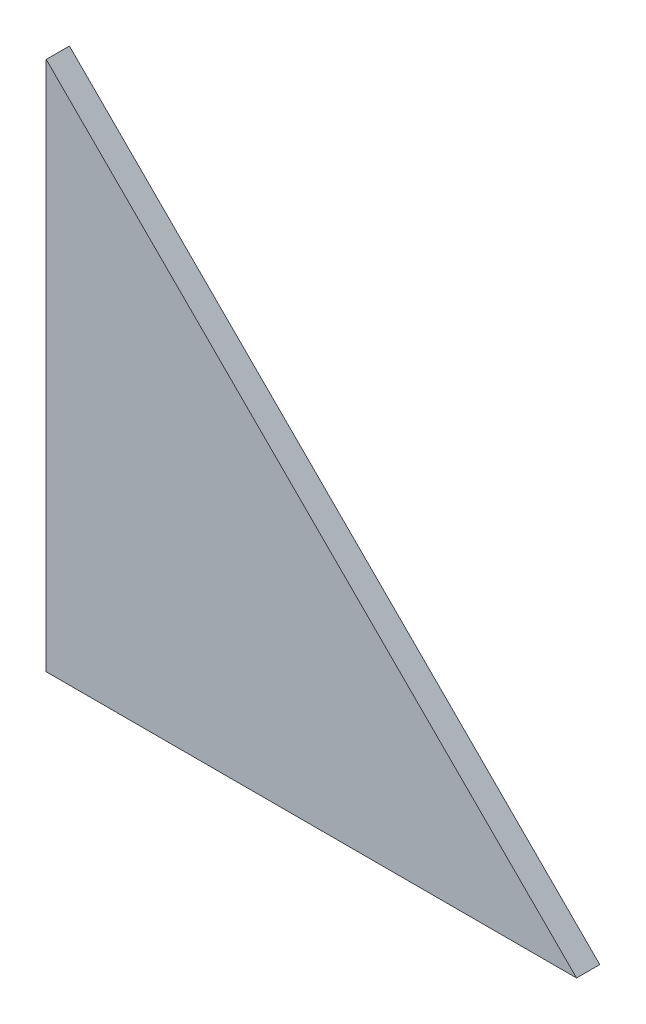
ISO-10303-21;
HEADER;
FILE_DESCRIPTION(('STEP AP214'),'2;1');
FILE_NAME('part.step','',(''),(''),'','','');
FILE_SCHEMA(('AUTOMOTIVE_DESIGN { 1 0 10303 214 1 1 1 1 }'));
ENDSEC;
DATA;
#1=APPLICATION_CONTEXT('core data for automotive mechanical design processes');
#2=APPLICATION_PROTOCOL_DEFINITION('international standard','automotive_design',2000,#1);
#3=PRODUCT_CONTEXT('',#1,'mechanical');
#4=PRODUCT('Part','Part','',(#3));
#5=PRODUCT_RELATED_PRODUCT_CATEGORY('part','',(#4));
#6=PRODUCT_DEFINITION_FORMATION('','',#4);
#7=PRODUCT_DEFINITION_CONTEXT('part definition',#1,'design');
#8=PRODUCT_DEFINITION('design','',#6,#7);
#9=PRODUCT_DEFINITION_SHAPE('','',#8);
#10=(LENGTH_UNIT() NAMED_UNIT(*) SI_UNIT(.MILLI.,.METRE.));
#11=(NAMED_UNIT(*) PLANE_ANGLE_UNIT() SI_UNIT($,.RADIAN.));
#12=(NAMED_UNIT(*) SI_UNIT($,.STERADIAN.) SOLID_ANGLE_UNIT());
#13=UNCERTAINTY_MEASURE_WITH_UNIT(LENGTH_MEASURE(1.E-05),#10,'distance_accuracy_value','');
#14=(GEOMETRIC_REPRESENTATION_CONTEXT(3) GLOBAL_UNCERTAINTY_ASSIGNED_CONTEXT((#13)) GLOBAL_UNIT_ASSIGNED_CONTEXT((#10,
#11,#12)) REPRESENTATION_CONTEXT('',''));
#15=CARTESIAN_POINT('',(0.,0.,0.));
#16=DIRECTION('',(0.,0.,1.));
#17=DIRECTION('',(1.,0.,0.));
#18=AXIS2_PLACEMENT_3D('',#15,#16,#17);
#19=CARTESIAN_POINT('',(0.,0.,4.445));
#20=DIRECTION('',(1.,0.,0.));
#21=DIRECTION('',(0.,0.,-1.));
#22=AXIS2_PLACEMENT_3D('',#19,#20,#21);
#23=PLANE('',#22);
#24=DIRECTION('',(0.,-1.,0.));
#25=VECTOR('',#24,1.);
#26=CARTESIAN_POINT('',(0.,0.,0.));
#27=LINE('',#26,#25);
#28=CARTESIAN_POINT('',(0.,101.6,0.));
#29=VERTEX_POINT('',#28);
#30=CARTESIAN_POINT('',(0.,0.,0.));
#31=VERTEX_POINT('',#30);
#32=EDGE_CURVE('E80',#29,#31,#27,.T.);
#33=ORIENTED_EDGE('',*,*,#32,.T.);
#34=DIRECTION('',(0.,0.,-1.));
#35=VECTOR('',#34,1.);
#36=CARTESIAN_POINT('',(0.,0.,4.445));
#37=LINE('',#36,#35);
#38=CARTESIAN_POINT('',(0.,0.,4.445));
#39=VERTEX_POINT('',#38);
#40=EDGE_CURVE('E11',#39,#31,#37,.T.);
#41=ORIENTED_EDGE('',*,*,#40,.F.);
#42=DIRECTION('',(0.,-1.,0.));
#43=VECTOR('',#42,1.);
#44=CARTESIAN_POINT('',(0.,0.,4.445));
#45=LINE('',#44,#43);
#46=CARTESIAN_POINT('',(0.,101.6,4.445));
#47=VERTEX_POINT('',#46);
#48=EDGE_CURVE('E73',#47,#39,#45,.T.);
#49=ORIENTED_EDGE('',*,*,#48,.F.);
#50=DIRECTION('',(0.,0.,-1.));
#51=VECTOR('',#50,1.);
#52=CARTESIAN_POINT('',(0.,101.6,4.445));
#53=LINE('',#52,#51);
#54=EDGE_CURVE('E81',#47,#29,#53,.T.);
#55=ORIENTED_EDGE('',*,*,#54,.T.);
#56=EDGE_LOOP('',(#33,#41,#49,#55));
#57=FACE_BOUND('',#56,.T.);
#58=ADVANCED_FACE('F33',(#57),#23,.F.);
#59=CARTESIAN_POINT('',(0.,0.,4.445));
#60=DIRECTION('',(0.,1.,0.));
#61=DIRECTION('',(0.,0.,1.));
#62=AXIS2_PLACEMENT_3D('',#59,#60,#61);
#63=PLANE('',#62);
#64=DIRECTION('',(1.,0.,0.));
#65=VECTOR('',#64,1.);
#66=CARTESIAN_POINT('',(0.,0.,0.));
#67=LINE('',#66,#65);
#68=CARTESIAN_POINT('',(101.6,0.,0.));
#69=VERTEX_POINT('',#68);
#70=EDGE_CURVE('E61',#31,#69,#67,.T.);
#71=ORIENTED_EDGE('',*,*,#70,.T.);
#72=DIRECTION('',(0.,0.,-1.));
#73=VECTOR('',#72,1.);
#74=CARTESIAN_POINT('',(101.6,0.,4.445));
#75=LINE('',#74,#73);
#76=CARTESIAN_POINT('',(101.6,0.,4.445));
#77=VERTEX_POINT('',#76);
#78=EDGE_CURVE('E41',#77,#69,#75,.T.);
#79=ORIENTED_EDGE('',*,*,#78,.F.);
#80=DIRECTION('',(1.,0.,0.));
#81=VECTOR('',#80,1.);
#82=CARTESIAN_POINT('',(0.,0.,4.445));
#83=LINE('',#82,#81);
#84=EDGE_CURVE('E69',#39,#77,#83,.T.);
#85=ORIENTED_EDGE('',*,*,#84,.F.);
#86=ORIENTED_EDGE('',*,*,#40,.T.);
#87=EDGE_LOOP('',(#71,#79,#85,#86));
#88=FACE_BOUND('',#87,.T.);
#89=ADVANCED_FACE('F70',(#88),#63,.F.);
#90=CARTESIAN_POINT('',(0.,101.6,4.445));
#91=DIRECTION('',(-0.707106781186548,-0.707106781186548,0.));
#92=DIRECTION('',(0.707106781186548,-0.707106781186548,0.));
#93=AXIS2_PLACEMENT_3D('',#90,#91,#92);
#94=PLANE('',#93);
#95=DIRECTION('',(-0.707106781186547,0.707106781186547,0.));
#96=VECTOR('',#95,1.);
#97=CARTESIAN_POINT('',(0.,101.6,0.));
#98=LINE('',#97,#96);
#99=EDGE_CURVE('E66',#69,#29,#98,.T.);
#100=ORIENTED_EDGE('',*,*,#99,.T.);
#101=ORIENTED_EDGE('',*,*,#54,.F.);
#102=DIRECTION('',(-0.707106781186547,0.707106781186547,0.));
#103=VECTOR('',#102,1.);
#104=CARTESIAN_POINT('',(0.,101.6,4.445));
#105=LINE('',#104,#103);
#106=EDGE_CURVE('E49',#77,#47,#105,.T.);
#107=ORIENTED_EDGE('',*,*,#106,.F.);
#108=ORIENTED_EDGE('',*,*,#78,.T.);
#109=EDGE_LOOP('',(#100,#101,#107,#108));
#110=FACE_BOUND('',#109,.T.);
#111=ADVANCED_FACE('F88',(#110),#94,.F.);
#112=CARTESIAN_POINT('',(0.,0.,4.445));
#113=DIRECTION('',(0.,0.,-1.));
#114=DIRECTION('',(-1.,0.,0.));
#115=AXIS2_PLACEMENT_3D('',#112,#113,#114);
#116=PLANE('',#115);
#117=ORIENTED_EDGE('',*,*,#48,.T.);
#118=ORIENTED_EDGE('',*,*,#84,.T.);
#119=ORIENTED_EDGE('',*,*,#106,.T.);
#120=EDGE_LOOP('',(#117,#118,#119));
#121=FACE_BOUND('',#120,.T.);
#122=ADVANCED_FACE('F76',(#121),#116,.F.);
#123=CARTESIAN_POINT('',(0.,0.,0.));
#124=DIRECTION('',(0.,0.,-1.));
#125=DIRECTION('',(-1.,0.,0.));
#126=AXIS2_PLACEMENT_3D('',#123,#124,#125);
#127=PLANE('',#126);
#128=ORIENTED_EDGE('',*,*,#32,.F.);
#129=ORIENTED_EDGE('',*,*,#99,.F.);
#130=ORIENTED_EDGE('',*,*,#70,.F.);
#131=EDGE_LOOP('',(#128,#129,#130));
#132=FACE_BOUND('',#131,.T.);
#133=ADVANCED_FACE('F89',(#132),#127,.T.);
#134=CLOSED_SHELL('',(#58,#89,#111,#122,#133));
#135=MANIFOLD_SOLID_BREP('B2',#134);
#136=ADVANCED_BREP_SHAPE_REPRESENTATION('',(#18,#135),#14);
#137=SHAPE_DEFINITION_REPRESENTATION(#9,#136);
ENDSEC;
END-ISO-10303-21;
